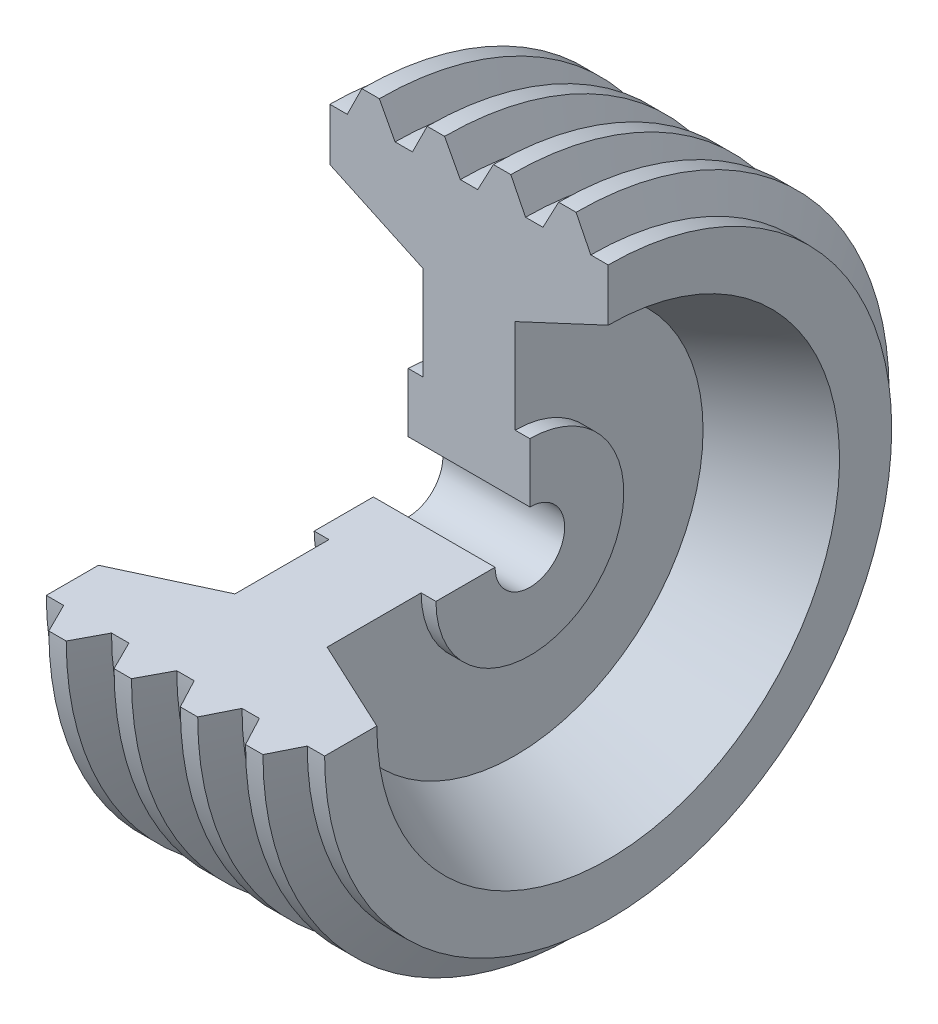
ISO-10303-21;
HEADER;
FILE_DESCRIPTION(('STEP AP214'),'2;1');
FILE_NAME('part.step','',(''),(''),'','','');
FILE_SCHEMA(('AUTOMOTIVE_DESIGN { 1 0 10303 214 1 1 1 1 }'));
ENDSEC;
DATA;
#1=APPLICATION_CONTEXT('core data for automotive mechanical design processes');
#2=APPLICATION_PROTOCOL_DEFINITION('international standard','automotive_design',2000,#1);
#3=PRODUCT_CONTEXT('',#1,'mechanical');
#4=PRODUCT('Part','Part','',(#3));
#5=PRODUCT_RELATED_PRODUCT_CATEGORY('part','',(#4));
#6=PRODUCT_DEFINITION_FORMATION('','',#4);
#7=PRODUCT_DEFINITION_CONTEXT('part definition',#1,'design');
#8=PRODUCT_DEFINITION('design','',#6,#7);
#9=PRODUCT_DEFINITION_SHAPE('','',#8);
#10=(LENGTH_UNIT() NAMED_UNIT(*) SI_UNIT(.MILLI.,.METRE.));
#11=(NAMED_UNIT(*) PLANE_ANGLE_UNIT() SI_UNIT($,.RADIAN.));
#12=(NAMED_UNIT(*) SI_UNIT($,.STERADIAN.) SOLID_ANGLE_UNIT());
#13=UNCERTAINTY_MEASURE_WITH_UNIT(LENGTH_MEASURE(1.E-05),#10,'distance_accuracy_value','');
#14=(GEOMETRIC_REPRESENTATION_CONTEXT(3) GLOBAL_UNCERTAINTY_ASSIGNED_CONTEXT((#13)) GLOBAL_UNIT_ASSIGNED_CONTEXT((#10,
#11,#12)) REPRESENTATION_CONTEXT('',''));
#15=CARTESIAN_POINT('',(0.,0.,0.));
#16=DIRECTION('',(0.,0.,1.));
#17=DIRECTION('',(1.,0.,0.));
#18=AXIS2_PLACEMENT_3D('',#15,#16,#17);
#19=CARTESIAN_POINT('',(35.,2.09488880330588E-13,20.));
#20=DIRECTION('',(1.,0.,0.));
#21=DIRECTION('',(0.,0.,-1.));
#22=AXIS2_PLACEMENT_3D('',#19,#20,#21);
#23=PLANE('',#22);
#24=CARTESIAN_POINT('',(35.,0.,0.));
#25=DIRECTION('',(1.,0.,0.));
#26=DIRECTION('',(0.,0.,-1.));
#27=AXIS2_PLACEMENT_3D('',#24,#25,#26);
#28=CIRCLE('',#27,54.);
#29=CARTESIAN_POINT('',(35.,5.65619976892588E-13,54.));
#30=VERTEX_POINT('',#29);
#31=CARTESIAN_POINT('',(35.,54.,0.));
#32=VERTEX_POINT('',#31);
#33=EDGE_CURVE('E11',#30,#32,#28,.T.);
#34=ORIENTED_EDGE('',*,*,#33,.T.);
#35=DIRECTION('',(0.,1.,0.));
#36=VECTOR('',#35,1.);
#37=CARTESIAN_POINT('',(35.,20.,0.));
#38=LINE('',#37,#36);
#39=CARTESIAN_POINT('',(35.,20.,0.));
#40=VERTEX_POINT('',#39);
#41=EDGE_CURVE('E221',#40,#32,#38,.T.);
#42=ORIENTED_EDGE('',*,*,#41,.F.);
#43=CARTESIAN_POINT('',(35.,0.,0.));
#44=DIRECTION('',(1.,0.,0.));
#45=DIRECTION('',(0.,0.,-1.));
#46=AXIS2_PLACEMENT_3D('',#43,#44,#45);
#47=CIRCLE('',#46,20.);
#48=CARTESIAN_POINT('',(35.,2.09488880330588E-13,20.));
#49=VERTEX_POINT('',#48);
#50=EDGE_CURVE('E52',#49,#40,#47,.T.);
#51=ORIENTED_EDGE('',*,*,#50,.F.);
#52=DIRECTION('',(0.,0.,1.));
#53=VECTOR('',#52,1.);
#54=CARTESIAN_POINT('',(35.,2.09488880330588E-13,20.));
#55=LINE('',#54,#53);
#56=EDGE_CURVE('E223',#49,#30,#55,.T.);
#57=ORIENTED_EDGE('',*,*,#56,.T.);
#58=EDGE_LOOP('',(#34,#42,#51,#57));
#59=FACE_BOUND('',#58,.T.);
#60=ADVANCED_FACE('F37',(#59),#23,.T.);
#61=CARTESIAN_POINT('',(0.,0.,0.));
#62=DIRECTION('',(1.,0.,0.));
#63=DIRECTION('',(0.,0.,-1.));
#64=AXIS2_PLACEMENT_3D('',#61,#62,#63);
#65=CYLINDRICAL_SURFACE('',#64,54.);
#66=CARTESIAN_POINT('',(26.5,0.,0.));
#67=DIRECTION('',(1.,0.,0.));
#68=DIRECTION('',(0.,0.,-1.));
#69=AXIS2_PLACEMENT_3D('',#66,#67,#68);
#70=CIRCLE('',#69,54.);
#71=CARTESIAN_POINT('',(26.5,5.65619976892588E-13,54.));
#72=VERTEX_POINT('',#71);
#73=CARTESIAN_POINT('',(26.5,54.,0.));
#74=VERTEX_POINT('',#73);
#75=EDGE_CURVE('E45',#72,#74,#70,.T.);
#76=ORIENTED_EDGE('',*,*,#75,.T.);
#77=DIRECTION('',(-1.,0.,0.));
#78=VECTOR('',#77,1.);
#79=CARTESIAN_POINT('',(35.,54.,0.));
#80=LINE('',#79,#78);
#81=EDGE_CURVE('E232',#32,#74,#80,.T.);
#82=ORIENTED_EDGE('',*,*,#81,.F.);
#83=ORIENTED_EDGE('',*,*,#33,.F.);
#84=DIRECTION('',(-1.,0.,0.));
#85=VECTOR('',#84,1.);
#86=CARTESIAN_POINT('',(35.,5.65619976892588E-13,54.));
#87=LINE('',#86,#85);
#88=EDGE_CURVE('E314',#30,#72,#87,.T.);
#89=ORIENTED_EDGE('',*,*,#88,.T.);
#90=EDGE_LOOP('',(#76,#82,#83,#89));
#91=FACE_BOUND('',#90,.T.);
#92=ADVANCED_FACE('F39',(#91),#65,.T.);
#93=CARTESIAN_POINT('',(26.5,5.65619976892588E-13,54.));
#94=DIRECTION('',(1.,0.,0.));
#95=DIRECTION('',(0.,0.,-1.));
#96=AXIS2_PLACEMENT_3D('',#93,#94,#95);
#97=PLANE('',#96);
#98=CARTESIAN_POINT('',(26.5,0.,0.));
#99=DIRECTION('',(1.,0.,0.));
#100=DIRECTION('',(0.,0.,-1.));
#101=AXIS2_PLACEMENT_3D('',#98,#99,#100);
#102=CIRCLE('',#101,108.052540288708);
#103=CARTESIAN_POINT('',(26.5,1.13179028409786E-12,108.052540288708));
#104=VERTEX_POINT('',#103);
#105=CARTESIAN_POINT('',(26.5,108.052540288708,0.));
#106=VERTEX_POINT('',#105);
#107=EDGE_CURVE('E440',#104,#106,#102,.T.);
#108=ORIENTED_EDGE('',*,*,#107,.T.);
#109=DIRECTION('',(0.,1.,0.));
#110=VECTOR('',#109,1.);
#111=CARTESIAN_POINT('',(26.5,54.,0.));
#112=LINE('',#111,#110);
#113=EDGE_CURVE('E237',#74,#106,#112,.T.);
#114=ORIENTED_EDGE('',*,*,#113,.F.);
#115=ORIENTED_EDGE('',*,*,#75,.F.);
#116=DIRECTION('',(0.,0.,1.));
#117=VECTOR('',#116,1.);
#118=CARTESIAN_POINT('',(26.5,5.65619976892588E-13,54.));
#119=LINE('',#118,#117);
#120=EDGE_CURVE('E316',#72,#104,#119,.T.);
#121=ORIENTED_EDGE('',*,*,#120,.T.);
#122=EDGE_LOOP('',(#108,#114,#115,#121));
#123=FACE_BOUND('',#122,.T.);
#124=ADVANCED_FACE('F442',(#123),#97,.T.);
#125=CARTESIAN_POINT('',(26.5,0.,0.));
#126=DIRECTION('',(1.,0.,0.));
#127=DIRECTION('',(0.,0.,-1.));
#128=AXIS2_PLACEMENT_3D('',#125,#126,#127);
#129=CONICAL_SURFACE('',#128,108.052540288708,0.43633231299858);
#130=CARTESIAN_POINT('',(80.,0.,0.));
#131=DIRECTION('',(1.,0.,0.));
#132=DIRECTION('',(0.,0.,-1.));
#133=AXIS2_PLACEMENT_3D('',#130,#131,#132);
#134=CIRCLE('',#133,133.);
#135=CARTESIAN_POINT('',(80.,1.39310105419841E-12,133.));
#136=VERTEX_POINT('',#135);
#137=CARTESIAN_POINT('',(80.,133.,0.));
#138=VERTEX_POINT('',#137);
#139=EDGE_CURVE('E438',#136,#138,#134,.T.);
#140=ORIENTED_EDGE('',*,*,#139,.T.);
#141=DIRECTION('',(0.906307787036651,0.422618261740697,0.));
#142=VECTOR('',#141,1.);
#143=CARTESIAN_POINT('',(26.5,108.052540288708,0.));
#144=LINE('',#143,#142);
#145=EDGE_CURVE('E239',#106,#138,#144,.T.);
#146=ORIENTED_EDGE('',*,*,#145,.F.);
#147=ORIENTED_EDGE('',*,*,#107,.F.);
#148=DIRECTION('',(0.906307787036651,0.,0.422618261740697));
#149=VECTOR('',#148,1.);
#150=CARTESIAN_POINT('',(26.5,1.13179028409786E-12,108.052540288708));
#151=LINE('',#150,#149);
#152=EDGE_CURVE('E319',#104,#136,#151,.T.);
#153=ORIENTED_EDGE('',*,*,#152,.T.);
#154=EDGE_LOOP('',(#140,#146,#147,#153));
#155=FACE_BOUND('',#154,.T.);
#156=ADVANCED_FACE('F448',(#155),#129,.F.);
#157=CARTESIAN_POINT('',(80.,1.39310105419841E-12,133.));
#158=DIRECTION('',(1.,0.,0.));
#159=DIRECTION('',(0.,0.,-1.));
#160=AXIS2_PLACEMENT_3D('',#157,#158,#159);
#161=PLANE('',#160);
#162=CARTESIAN_POINT('',(80.,0.,0.));
#163=DIRECTION('',(1.,0.,0.));
#164=DIRECTION('',(0.,0.,-1.));
#165=AXIS2_PLACEMENT_3D('',#162,#163,#164);
#166=CIRCLE('',#165,163.);
#167=CARTESIAN_POINT('',(80.,1.70733437469429E-12,163.));
#168=VERTEX_POINT('',#167);
#169=CARTESIAN_POINT('',(80.,163.,0.));
#170=VERTEX_POINT('',#169);
#171=EDGE_CURVE('E436',#168,#170,#166,.T.);
#172=ORIENTED_EDGE('',*,*,#171,.T.);
#173=DIRECTION('',(0.,1.,0.));
#174=VECTOR('',#173,1.);
#175=CARTESIAN_POINT('',(80.,133.,0.));
#176=LINE('',#175,#174);
#177=EDGE_CURVE('E244',#138,#170,#176,.T.);
#178=ORIENTED_EDGE('',*,*,#177,.F.);
#179=ORIENTED_EDGE('',*,*,#139,.F.);
#180=DIRECTION('',(0.,0.,1.));
#181=VECTOR('',#180,1.);
#182=CARTESIAN_POINT('',(80.,1.39310105419841E-12,133.));
#183=LINE('',#182,#181);
#184=EDGE_CURVE('E322',#136,#168,#183,.T.);
#185=ORIENTED_EDGE('',*,*,#184,.T.);
#186=EDGE_LOOP('',(#172,#178,#179,#185));
#187=FACE_BOUND('',#186,.T.);
#188=ADVANCED_FACE('F451',(#187),#161,.T.);
#189=CARTESIAN_POINT('',(0.,0.,0.));
#190=DIRECTION('',(1.,0.,0.));
#191=DIRECTION('',(0.,0.,-1.));
#192=AXIS2_PLACEMENT_3D('',#189,#190,#191);
#193=CYLINDRICAL_SURFACE('',#192,163.);
#194=CARTESIAN_POINT('',(70.,0.,0.));
#195=DIRECTION('',(1.,0.,0.));
#196=DIRECTION('',(0.,0.,-1.));
#197=AXIS2_PLACEMENT_3D('',#194,#195,#196);
#198=CIRCLE('',#197,163.);
#199=CARTESIAN_POINT('',(70.,1.70733437469429E-12,163.));
#200=VERTEX_POINT('',#199);
#201=CARTESIAN_POINT('',(70.,163.,0.));
#202=VERTEX_POINT('',#201);
#203=EDGE_CURVE('E434',#200,#202,#198,.T.);
#204=ORIENTED_EDGE('',*,*,#203,.T.);
#205=DIRECTION('',(-1.,0.,0.));
#206=VECTOR('',#205,1.);
#207=CARTESIAN_POINT('',(80.,163.,0.));
#208=LINE('',#207,#206);
#209=EDGE_CURVE('E247',#170,#202,#208,.T.);
#210=ORIENTED_EDGE('',*,*,#209,.F.);
#211=ORIENTED_EDGE('',*,*,#171,.F.);
#212=DIRECTION('',(-1.,0.,0.));
#213=VECTOR('',#212,1.);
#214=CARTESIAN_POINT('',(80.,1.70733437469429E-12,163.));
#215=LINE('',#214,#213);
#216=EDGE_CURVE('E325',#168,#200,#215,.T.);
#217=ORIENTED_EDGE('',*,*,#216,.T.);
#218=EDGE_LOOP('',(#204,#210,#211,#217));
#219=FACE_BOUND('',#218,.T.);
#220=ADVANCED_FACE('F456',(#219),#193,.T.);
#221=CARTESIAN_POINT('',(70.,0.,0.));
#222=DIRECTION('',(-1.,0.,0.));
#223=DIRECTION('',(0.,0.,1.));
#224=AXIS2_PLACEMENT_3D('',#221,#222,#223);
#225=CONICAL_SURFACE('',#224,163.,1.10898854020423);
#226=CARTESIAN_POINT('',(61.539060338245,0.,0.));
#227=DIRECTION('',(1.,0.,0.));
#228=DIRECTION('',(0.,0.,-1.));
#229=AXIS2_PLACEMENT_3D('',#226,#227,#228);
#230=CIRCLE('',#229,180.);
#231=CARTESIAN_POINT('',(61.539060338245,1.88539992297529E-12,180.));
#232=VERTEX_POINT('',#231);
#233=CARTESIAN_POINT('',(61.539060338245,180.,0.));
#234=VERTEX_POINT('',#233);
#235=EDGE_CURVE('E432',#232,#234,#230,.T.);
#236=ORIENTED_EDGE('',*,*,#235,.T.);
#237=DIRECTION('',(-0.445567252341254,0.895248470337183,0.));
#238=VECTOR('',#237,1.);
#239=CARTESIAN_POINT('',(70.,163.,0.));
#240=LINE('',#239,#238);
#241=EDGE_CURVE('E250',#202,#234,#240,.T.);
#242=ORIENTED_EDGE('',*,*,#241,.F.);
#243=ORIENTED_EDGE('',*,*,#203,.F.);
#244=DIRECTION('',(-0.445567252341254,0.,0.895248470337183));
#245=VECTOR('',#244,1.);
#246=CARTESIAN_POINT('',(70.,1.70733437469429E-12,163.));
#247=LINE('',#246,#245);
#248=EDGE_CURVE('E328',#200,#232,#247,.T.);
#249=ORIENTED_EDGE('',*,*,#248,.T.);
#250=EDGE_LOOP('',(#236,#242,#243,#249));
#251=FACE_BOUND('',#250,.T.);
#252=ADVANCED_FACE('F459',(#251),#225,.T.);
#253=CARTESIAN_POINT('',(0.,0.,0.));
#254=DIRECTION('',(1.,0.,0.));
#255=DIRECTION('',(0.,0.,-1.));
#256=AXIS2_PLACEMENT_3D('',#253,#254,#255);
#257=CYLINDRICAL_SURFACE('',#256,180.);
#258=CARTESIAN_POINT('',(51.539060338245,0.,0.));
#259=DIRECTION('',(1.,0.,0.));
#260=DIRECTION('',(0.,0.,-1.));
#261=AXIS2_PLACEMENT_3D('',#258,#259,#260);
#262=CIRCLE('',#261,180.);
#263=CARTESIAN_POINT('',(51.539060338245,1.88539992297529E-12,180.));
#264=VERTEX_POINT('',#263);
#265=CARTESIAN_POINT('',(51.539060338245,180.,0.));
#266=VERTEX_POINT('',#265);
#267=EDGE_CURVE('E430',#264,#266,#262,.T.);
#268=ORIENTED_EDGE('',*,*,#267,.T.);
#269=DIRECTION('',(-1.,0.,0.));
#270=VECTOR('',#269,1.);
#271=CARTESIAN_POINT('',(61.539060338245,180.,0.));
#272=LINE('',#271,#270);
#273=EDGE_CURVE('E253',#234,#266,#272,.T.);
#274=ORIENTED_EDGE('',*,*,#273,.F.);
#275=ORIENTED_EDGE('',*,*,#235,.F.);
#276=DIRECTION('',(-1.,0.,0.));
#277=VECTOR('',#276,1.);
#278=CARTESIAN_POINT('',(61.539060338245,1.88539992297529E-12,180.));
#279=LINE('',#278,#277);
#280=EDGE_CURVE('E331',#232,#264,#279,.T.);
#281=ORIENTED_EDGE('',*,*,#280,.T.);
#282=EDGE_LOOP('',(#268,#274,#275,#281));
#283=FACE_BOUND('',#282,.T.);
#284=ADVANCED_FACE('F464',(#283),#257,.T.);
#285=CARTESIAN_POINT('',(51.539060338245,0.,0.));
#286=DIRECTION('',(1.,0.,0.));
#287=DIRECTION('',(0.,0.,-1.));
#288=AXIS2_PLACEMENT_3D('',#285,#286,#287);
#289=CONICAL_SURFACE('',#288,180.,1.08210413623649);
#290=CARTESIAN_POINT('',(42.5,0.,0.));
#291=DIRECTION('',(1.,0.,0.));
#292=DIRECTION('',(0.,0.,-1.));
#293=AXIS2_PLACEMENT_3D('',#290,#291,#292);
#294=CIRCLE('',#293,163.);
#295=CARTESIAN_POINT('',(42.5,1.70733437469429E-12,163.));
#296=VERTEX_POINT('',#295);
#297=CARTESIAN_POINT('',(42.5,163.,0.));
#298=VERTEX_POINT('',#297);
#299=EDGE_CURVE('E428',#296,#298,#294,.T.);
#300=ORIENTED_EDGE('',*,*,#299,.T.);
#301=DIRECTION('',(-0.469471562785888,-0.882947592858928,0.));
#302=VECTOR('',#301,1.);
#303=CARTESIAN_POINT('',(51.539060338245,180.,0.));
#304=LINE('',#303,#302);
#305=EDGE_CURVE('E256',#266,#298,#304,.T.);
#306=ORIENTED_EDGE('',*,*,#305,.F.);
#307=ORIENTED_EDGE('',*,*,#267,.F.);
#308=DIRECTION('',(-0.469471562785888,0.,-0.882947592858928));
#309=VECTOR('',#308,1.);
#310=CARTESIAN_POINT('',(51.539060338245,1.88539992297529E-12,180.));
#311=LINE('',#310,#309);
#312=EDGE_CURVE('E334',#264,#296,#311,.T.);
#313=ORIENTED_EDGE('',*,*,#312,.T.);
#314=EDGE_LOOP('',(#300,#306,#307,#313));
#315=FACE_BOUND('',#314,.T.);
#316=ADVANCED_FACE('F467',(#315),#289,.T.);
#317=CARTESIAN_POINT('',(0.,0.,0.));
#318=DIRECTION('',(1.,0.,0.));
#319=DIRECTION('',(0.,0.,-1.));
#320=AXIS2_PLACEMENT_3D('',#317,#318,#319);
#321=CYLINDRICAL_SURFACE('',#320,163.);
#322=CARTESIAN_POINT('',(32.5,0.,0.));
#323=DIRECTION('',(1.,0.,0.));
#324=DIRECTION('',(0.,0.,-1.));
#325=AXIS2_PLACEMENT_3D('',#322,#323,#324);
#326=CIRCLE('',#325,163.);
#327=CARTESIAN_POINT('',(32.5,1.70733437469429E-12,163.));
#328=VERTEX_POINT('',#327);
#329=CARTESIAN_POINT('',(32.5,163.,0.));
#330=VERTEX_POINT('',#329);
#331=EDGE_CURVE('E426',#328,#330,#326,.T.);
#332=ORIENTED_EDGE('',*,*,#331,.T.);
#333=DIRECTION('',(-1.,0.,0.));
#334=VECTOR('',#333,1.);
#335=CARTESIAN_POINT('',(42.5,163.,0.));
#336=LINE('',#335,#334);
#337=EDGE_CURVE('E259',#298,#330,#336,.T.);
#338=ORIENTED_EDGE('',*,*,#337,.F.);
#339=ORIENTED_EDGE('',*,*,#299,.F.);
#340=DIRECTION('',(-1.,0.,0.));
#341=VECTOR('',#340,1.);
#342=CARTESIAN_POINT('',(42.5,1.70733437469429E-12,163.));
#343=LINE('',#342,#341);
#344=EDGE_CURVE('E337',#296,#328,#343,.T.);
#345=ORIENTED_EDGE('',*,*,#344,.T.);
#346=EDGE_LOOP('',(#332,#338,#339,#345));
#347=FACE_BOUND('',#346,.T.);
#348=ADVANCED_FACE('F472',(#347),#321,.T.);
#349=CARTESIAN_POINT('',(32.5,0.,0.));
#350=DIRECTION('',(-1.,0.,0.));
#351=DIRECTION('',(0.,0.,1.));
#352=AXIS2_PLACEMENT_3D('',#349,#350,#351);
#353=CONICAL_SURFACE('',#352,163.,1.10898854020423);
#354=CARTESIAN_POINT('',(24.039060338245,0.,0.));
#355=DIRECTION('',(1.,0.,0.));
#356=DIRECTION('',(0.,0.,-1.));
#357=AXIS2_PLACEMENT_3D('',#354,#355,#356);
#358=CIRCLE('',#357,180.);
#359=CARTESIAN_POINT('',(24.039060338245,1.88539992297529E-12,180.));
#360=VERTEX_POINT('',#359);
#361=CARTESIAN_POINT('',(24.039060338245,180.,0.));
#362=VERTEX_POINT('',#361);
#363=EDGE_CURVE('E424',#360,#362,#358,.T.);
#364=ORIENTED_EDGE('',*,*,#363,.T.);
#365=DIRECTION('',(-0.445567252341253,0.895248470337183,0.));
#366=VECTOR('',#365,1.);
#367=CARTESIAN_POINT('',(32.5,163.,0.));
#368=LINE('',#367,#366);
#369=EDGE_CURVE('E262',#330,#362,#368,.T.);
#370=ORIENTED_EDGE('',*,*,#369,.F.);
#371=ORIENTED_EDGE('',*,*,#331,.F.);
#372=DIRECTION('',(-0.445567252341253,0.,0.895248470337183));
#373=VECTOR('',#372,1.);
#374=CARTESIAN_POINT('',(32.5,1.70733437469429E-12,163.));
#375=LINE('',#374,#373);
#376=EDGE_CURVE('E340',#328,#360,#375,.T.);
#377=ORIENTED_EDGE('',*,*,#376,.T.);
#378=EDGE_LOOP('',(#364,#370,#371,#377));
#379=FACE_BOUND('',#378,.T.);
#380=ADVANCED_FACE('F475',(#379),#353,.T.);
#381=CARTESIAN_POINT('',(0.,0.,0.));
#382=DIRECTION('',(1.,0.,0.));
#383=DIRECTION('',(0.,0.,-1.));
#384=AXIS2_PLACEMENT_3D('',#381,#382,#383);
#385=CYLINDRICAL_SURFACE('',#384,180.);
#386=CARTESIAN_POINT('',(14.039060338245,0.,0.));
#387=DIRECTION('',(1.,0.,0.));
#388=DIRECTION('',(0.,0.,-1.));
#389=AXIS2_PLACEMENT_3D('',#386,#387,#388);
#390=CIRCLE('',#389,180.);
#391=CARTESIAN_POINT('',(14.039060338245,1.88539992297529E-12,180.));
#392=VERTEX_POINT('',#391);
#393=CARTESIAN_POINT('',(14.039060338245,180.,0.));
#394=VERTEX_POINT('',#393);
#395=EDGE_CURVE('E422',#392,#394,#390,.T.);
#396=ORIENTED_EDGE('',*,*,#395,.T.);
#397=DIRECTION('',(-1.,0.,0.));
#398=VECTOR('',#397,1.);
#399=CARTESIAN_POINT('',(24.039060338245,180.,0.));
#400=LINE('',#399,#398);
#401=EDGE_CURVE('E265',#362,#394,#400,.T.);
#402=ORIENTED_EDGE('',*,*,#401,.F.);
#403=ORIENTED_EDGE('',*,*,#363,.F.);
#404=DIRECTION('',(-1.,0.,0.));
#405=VECTOR('',#404,1.);
#406=CARTESIAN_POINT('',(24.039060338245,1.88539992297529E-12,180.));
#407=LINE('',#406,#405);
#408=EDGE_CURVE('E343',#360,#392,#407,.T.);
#409=ORIENTED_EDGE('',*,*,#408,.T.);
#410=EDGE_LOOP('',(#396,#402,#403,#409));
#411=FACE_BOUND('',#410,.T.);
#412=ADVANCED_FACE('F480',(#411),#385,.T.);
#413=CARTESIAN_POINT('',(14.039060338245,0.,0.));
#414=DIRECTION('',(1.,0.,0.));
#415=DIRECTION('',(0.,0.,-1.));
#416=AXIS2_PLACEMENT_3D('',#413,#414,#415);
#417=CONICAL_SURFACE('',#416,180.,1.08210413623649);
#418=CARTESIAN_POINT('',(4.99999999999996,0.,0.));
#419=DIRECTION('',(1.,0.,0.));
#420=DIRECTION('',(0.,0.,-1.));
#421=AXIS2_PLACEMENT_3D('',#418,#419,#420);
#422=CIRCLE('',#421,163.);
#423=CARTESIAN_POINT('',(4.99999999999996,1.70733437469429E-12,163.));
#424=VERTEX_POINT('',#423);
#425=CARTESIAN_POINT('',(4.99999999999996,163.,0.));
#426=VERTEX_POINT('',#425);
#427=EDGE_CURVE('E420',#424,#426,#422,.T.);
#428=ORIENTED_EDGE('',*,*,#427,.T.);
#429=DIRECTION('',(-0.469471562785889,-0.882947592858928,0.));
#430=VECTOR('',#429,1.);
#431=CARTESIAN_POINT('',(14.039060338245,180.,0.));
#432=LINE('',#431,#430);
#433=EDGE_CURVE('E268',#394,#426,#432,.T.);
#434=ORIENTED_EDGE('',*,*,#433,.F.);
#435=ORIENTED_EDGE('',*,*,#395,.F.);
#436=DIRECTION('',(-0.469471562785889,0.,-0.882947592858928));
#437=VECTOR('',#436,1.);
#438=CARTESIAN_POINT('',(14.039060338245,1.88539992297529E-12,180.));
#439=LINE('',#438,#437);
#440=EDGE_CURVE('E346',#392,#424,#439,.T.);
#441=ORIENTED_EDGE('',*,*,#440,.T.);
#442=EDGE_LOOP('',(#428,#434,#435,#441));
#443=FACE_BOUND('',#442,.T.);
#444=ADVANCED_FACE('F483',(#443),#417,.T.);
#445=CARTESIAN_POINT('',(0.,0.,0.));
#446=DIRECTION('',(1.,0.,0.));
#447=DIRECTION('',(0.,0.,-1.));
#448=AXIS2_PLACEMENT_3D('',#445,#446,#447);
#449=CYLINDRICAL_SURFACE('',#448,163.);
#450=CARTESIAN_POINT('',(-5.00000000000004,0.,0.));
#451=DIRECTION('',(1.,0.,0.));
#452=DIRECTION('',(0.,0.,-1.));
#453=AXIS2_PLACEMENT_3D('',#450,#451,#452);
#454=CIRCLE('',#453,163.);
#455=CARTESIAN_POINT('',(-5.00000000000004,1.70733437469429E-12,163.));
#456=VERTEX_POINT('',#455);
#457=CARTESIAN_POINT('',(-5.00000000000004,163.,0.));
#458=VERTEX_POINT('',#457);
#459=EDGE_CURVE('E418',#456,#458,#454,.T.);
#460=ORIENTED_EDGE('',*,*,#459,.T.);
#461=DIRECTION('',(-1.,0.,0.));
#462=VECTOR('',#461,1.);
#463=CARTESIAN_POINT('',(4.99999999999996,163.,0.));
#464=LINE('',#463,#462);
#465=EDGE_CURVE('E271',#426,#458,#464,.T.);
#466=ORIENTED_EDGE('',*,*,#465,.F.);
#467=ORIENTED_EDGE('',*,*,#427,.F.);
#468=DIRECTION('',(-1.,0.,0.));
#469=VECTOR('',#468,1.);
#470=CARTESIAN_POINT('',(4.99999999999996,1.70733437469429E-12,163.));
#471=LINE('',#470,#469);
#472=EDGE_CURVE('E349',#424,#456,#471,.T.);
#473=ORIENTED_EDGE('',*,*,#472,.T.);
#474=EDGE_LOOP('',(#460,#466,#467,#473));
#475=FACE_BOUND('',#474,.T.);
#476=ADVANCED_FACE('F488',(#475),#449,.T.);
#477=CARTESIAN_POINT('',(-5.00000000000004,0.,0.));
#478=DIRECTION('',(-1.,0.,0.));
#479=DIRECTION('',(0.,0.,1.));
#480=AXIS2_PLACEMENT_3D('',#477,#478,#479);
#481=CONICAL_SURFACE('',#480,163.,1.08210413623649);
#482=CARTESIAN_POINT('',(-14.0390603382451,0.,0.));
#483=DIRECTION('',(1.,0.,0.));
#484=DIRECTION('',(0.,0.,-1.));
#485=AXIS2_PLACEMENT_3D('',#482,#483,#484);
#486=CIRCLE('',#485,180.);
#487=CARTESIAN_POINT('',(-14.0390603382451,1.88539992297529E-12,180.));
#488=VERTEX_POINT('',#487);
#489=CARTESIAN_POINT('',(-14.0390603382451,180.,0.));
#490=VERTEX_POINT('',#489);
#491=EDGE_CURVE('E416',#488,#490,#486,.T.);
#492=ORIENTED_EDGE('',*,*,#491,.T.);
#493=DIRECTION('',(-0.469471562785889,0.882947592858928,0.));
#494=VECTOR('',#493,1.);
#495=CARTESIAN_POINT('',(-14.0390603382451,180.,0.));
#496=LINE('',#495,#494);
#497=EDGE_CURVE('E274',#458,#490,#496,.T.);
#498=ORIENTED_EDGE('',*,*,#497,.F.);
#499=ORIENTED_EDGE('',*,*,#459,.F.);
#500=DIRECTION('',(-0.469471562785889,0.,0.882947592858928));
#501=VECTOR('',#500,1.);
#502=CARTESIAN_POINT('',(-14.0390603382451,1.88539992297529E-12,180.));
#503=LINE('',#502,#501);
#504=EDGE_CURVE('E352',#456,#488,#503,.T.);
#505=ORIENTED_EDGE('',*,*,#504,.T.);
#506=EDGE_LOOP('',(#492,#498,#499,#505));
#507=FACE_BOUND('',#506,.T.);
#508=ADVANCED_FACE('F491',(#507),#481,.T.);
#509=CARTESIAN_POINT('',(0.,0.,0.));
#510=DIRECTION('',(1.,0.,0.));
#511=DIRECTION('',(0.,0.,-1.));
#512=AXIS2_PLACEMENT_3D('',#509,#510,#511);
#513=CYLINDRICAL_SURFACE('',#512,180.);
#514=CARTESIAN_POINT('',(-24.0390603382451,0.,0.));
#515=DIRECTION('',(1.,0.,0.));
#516=DIRECTION('',(0.,0.,-1.));
#517=AXIS2_PLACEMENT_3D('',#514,#515,#516);
#518=CIRCLE('',#517,180.);
#519=CARTESIAN_POINT('',(-24.0390603382451,1.88539992297529E-12,180.));
#520=VERTEX_POINT('',#519);
#521=CARTESIAN_POINT('',(-24.0390603382451,180.,0.));
#522=VERTEX_POINT('',#521);
#523=EDGE_CURVE('E414',#520,#522,#518,.T.);
#524=ORIENTED_EDGE('',*,*,#523,.T.);
#525=DIRECTION('',(-1.,0.,0.));
#526=VECTOR('',#525,1.);
#527=CARTESIAN_POINT('',(-24.0390603382451,180.,0.));
#528=LINE('',#527,#526);
#529=EDGE_CURVE('E277',#490,#522,#528,.T.);
#530=ORIENTED_EDGE('',*,*,#529,.F.);
#531=ORIENTED_EDGE('',*,*,#491,.F.);
#532=DIRECTION('',(-1.,0.,0.));
#533=VECTOR('',#532,1.);
#534=CARTESIAN_POINT('',(-24.0390603382451,1.88539992297529E-12,180.));
#535=LINE('',#534,#533);
#536=EDGE_CURVE('E355',#488,#520,#535,.T.);
#537=ORIENTED_EDGE('',*,*,#536,.T.);
#538=EDGE_LOOP('',(#524,#530,#531,#537));
#539=FACE_BOUND('',#538,.T.);
#540=ADVANCED_FACE('F496',(#539),#513,.T.);
#541=CARTESIAN_POINT('',(-24.0390603382451,0.,0.));
#542=DIRECTION('',(1.,0.,0.));
#543=DIRECTION('',(0.,0.,-1.));
#544=AXIS2_PLACEMENT_3D('',#541,#542,#543);
#545=CONICAL_SURFACE('',#544,180.,1.10898854020423);
#546=CARTESIAN_POINT('',(-32.5,0.,0.));
#547=DIRECTION('',(1.,0.,0.));
#548=DIRECTION('',(0.,0.,-1.));
#549=AXIS2_PLACEMENT_3D('',#546,#547,#548);
#550=CIRCLE('',#549,163.);
#551=CARTESIAN_POINT('',(-32.5,1.70733437469429E-12,163.));
#552=VERTEX_POINT('',#551);
#553=CARTESIAN_POINT('',(-32.5,163.,0.));
#554=VERTEX_POINT('',#553);
#555=EDGE_CURVE('E412',#552,#554,#550,.T.);
#556=ORIENTED_EDGE('',*,*,#555,.T.);
#557=DIRECTION('',(-0.445567252341252,-0.895248470337183,0.));
#558=VECTOR('',#557,1.);
#559=CARTESIAN_POINT('',(-32.5,163.,0.));
#560=LINE('',#559,#558);
#561=EDGE_CURVE('E280',#522,#554,#560,.T.);
#562=ORIENTED_EDGE('',*,*,#561,.F.);
#563=ORIENTED_EDGE('',*,*,#523,.F.);
#564=DIRECTION('',(-0.445567252341252,0.,-0.895248470337183));
#565=VECTOR('',#564,1.);
#566=CARTESIAN_POINT('',(-32.5,1.70733437469429E-12,163.));
#567=LINE('',#566,#565);
#568=EDGE_CURVE('E358',#520,#552,#567,.T.);
#569=ORIENTED_EDGE('',*,*,#568,.T.);
#570=EDGE_LOOP('',(#556,#562,#563,#569));
#571=FACE_BOUND('',#570,.T.);
#572=ADVANCED_FACE('F499',(#571),#545,.T.);
#573=CARTESIAN_POINT('',(0.,0.,0.));
#574=DIRECTION('',(1.,0.,0.));
#575=DIRECTION('',(0.,0.,-1.));
#576=AXIS2_PLACEMENT_3D('',#573,#574,#575);
#577=CYLINDRICAL_SURFACE('',#576,163.);
#578=CARTESIAN_POINT('',(-42.5,0.,0.));
#579=DIRECTION('',(1.,0.,0.));
#580=DIRECTION('',(0.,0.,-1.));
#581=AXIS2_PLACEMENT_3D('',#578,#579,#580);
#582=CIRCLE('',#581,163.);
#583=CARTESIAN_POINT('',(-42.5,1.70733437469429E-12,163.));
#584=VERTEX_POINT('',#583);
#585=CARTESIAN_POINT('',(-42.5,163.,0.));
#586=VERTEX_POINT('',#585);
#587=EDGE_CURVE('E410',#584,#586,#582,.T.);
#588=ORIENTED_EDGE('',*,*,#587,.T.);
#589=DIRECTION('',(-1.,0.,0.));
#590=VECTOR('',#589,1.);
#591=CARTESIAN_POINT('',(-42.5,163.,0.));
#592=LINE('',#591,#590);
#593=EDGE_CURVE('E283',#554,#586,#592,.T.);
#594=ORIENTED_EDGE('',*,*,#593,.F.);
#595=ORIENTED_EDGE('',*,*,#555,.F.);
#596=DIRECTION('',(-1.,0.,0.));
#597=VECTOR('',#596,1.);
#598=CARTESIAN_POINT('',(-42.5,1.70733437469429E-12,163.));
#599=LINE('',#598,#597);
#600=EDGE_CURVE('E361',#552,#584,#599,.T.);
#601=ORIENTED_EDGE('',*,*,#600,.T.);
#602=EDGE_LOOP('',(#588,#594,#595,#601));
#603=FACE_BOUND('',#602,.T.);
#604=ADVANCED_FACE('F504',(#603),#577,.T.);
#605=CARTESIAN_POINT('',(-42.5,0.,0.));
#606=DIRECTION('',(-1.,0.,0.));
#607=DIRECTION('',(0.,0.,1.));
#608=AXIS2_PLACEMENT_3D('',#605,#606,#607);
#609=CONICAL_SURFACE('',#608,163.,1.08210413623649);
#610=CARTESIAN_POINT('',(-51.5390603382451,0.,0.));
#611=DIRECTION('',(1.,0.,0.));
#612=DIRECTION('',(0.,0.,-1.));
#613=AXIS2_PLACEMENT_3D('',#610,#611,#612);
#614=CIRCLE('',#613,180.);
#615=CARTESIAN_POINT('',(-51.5390603382451,1.88539992297529E-12,180.));
#616=VERTEX_POINT('',#615);
#617=CARTESIAN_POINT('',(-51.5390603382451,180.,0.));
#618=VERTEX_POINT('',#617);
#619=EDGE_CURVE('E408',#616,#618,#614,.T.);
#620=ORIENTED_EDGE('',*,*,#619,.T.);
#621=DIRECTION('',(-0.469471562785888,0.882947592858928,0.));
#622=VECTOR('',#621,1.);
#623=CARTESIAN_POINT('',(-51.5390603382451,180.,0.));
#624=LINE('',#623,#622);
#625=EDGE_CURVE('E286',#586,#618,#624,.T.);
#626=ORIENTED_EDGE('',*,*,#625,.F.);
#627=ORIENTED_EDGE('',*,*,#587,.F.);
#628=DIRECTION('',(-0.469471562785888,0.,0.882947592858928));
#629=VECTOR('',#628,1.);
#630=CARTESIAN_POINT('',(-51.5390603382451,1.88539992297529E-12,180.));
#631=LINE('',#630,#629);
#632=EDGE_CURVE('E364',#584,#616,#631,.T.);
#633=ORIENTED_EDGE('',*,*,#632,.T.);
#634=EDGE_LOOP('',(#620,#626,#627,#633));
#635=FACE_BOUND('',#634,.T.);
#636=ADVANCED_FACE('F507',(#635),#609,.T.);
#637=CARTESIAN_POINT('',(0.,0.,0.));
#638=DIRECTION('',(1.,0.,0.));
#639=DIRECTION('',(0.,0.,-1.));
#640=AXIS2_PLACEMENT_3D('',#637,#638,#639);
#641=CYLINDRICAL_SURFACE('',#640,180.);
#642=CARTESIAN_POINT('',(-61.5390603382451,0.,0.));
#643=DIRECTION('',(1.,0.,0.));
#644=DIRECTION('',(0.,0.,-1.));
#645=AXIS2_PLACEMENT_3D('',#642,#643,#644);
#646=CIRCLE('',#645,180.);
#647=CARTESIAN_POINT('',(-61.5390603382451,1.88539992297529E-12,180.));
#648=VERTEX_POINT('',#647);
#649=CARTESIAN_POINT('',(-61.5390603382451,180.,0.));
#650=VERTEX_POINT('',#649);
#651=EDGE_CURVE('E406',#648,#650,#646,.T.);
#652=ORIENTED_EDGE('',*,*,#651,.T.);
#653=DIRECTION('',(-1.,0.,0.));
#654=VECTOR('',#653,1.);
#655=CARTESIAN_POINT('',(-61.5390603382451,180.,0.));
#656=LINE('',#655,#654);
#657=EDGE_CURVE('E289',#618,#650,#656,.T.);
#658=ORIENTED_EDGE('',*,*,#657,.F.);
#659=ORIENTED_EDGE('',*,*,#619,.F.);
#660=DIRECTION('',(-1.,0.,0.));
#661=VECTOR('',#660,1.);
#662=CARTESIAN_POINT('',(-61.5390603382451,1.88539992297529E-12,180.));
#663=LINE('',#662,#661);
#664=EDGE_CURVE('E367',#616,#648,#663,.T.);
#665=ORIENTED_EDGE('',*,*,#664,.T.);
#666=EDGE_LOOP('',(#652,#658,#659,#665));
#667=FACE_BOUND('',#666,.T.);
#668=ADVANCED_FACE('F512',(#667),#641,.T.);
#669=CARTESIAN_POINT('',(-61.5390603382451,0.,0.));
#670=DIRECTION('',(1.,0.,0.));
#671=DIRECTION('',(0.,0.,-1.));
#672=AXIS2_PLACEMENT_3D('',#669,#670,#671);
#673=CONICAL_SURFACE('',#672,180.,1.10898854020423);
#674=CARTESIAN_POINT('',(-70.,0.,0.));
#675=DIRECTION('',(1.,0.,0.));
#676=DIRECTION('',(0.,0.,-1.));
#677=AXIS2_PLACEMENT_3D('',#674,#675,#676);
#678=CIRCLE('',#677,163.);
#679=CARTESIAN_POINT('',(-70.,1.70733437469429E-12,163.));
#680=VERTEX_POINT('',#679);
#681=CARTESIAN_POINT('',(-70.,163.,0.));
#682=VERTEX_POINT('',#681);
#683=EDGE_CURVE('E404',#680,#682,#678,.T.);
#684=ORIENTED_EDGE('',*,*,#683,.T.);
#685=DIRECTION('',(-0.445567252341252,-0.895248470337183,0.));
#686=VECTOR('',#685,1.);
#687=CARTESIAN_POINT('',(-70.,163.,0.));
#688=LINE('',#687,#686);
#689=EDGE_CURVE('E292',#650,#682,#688,.T.);
#690=ORIENTED_EDGE('',*,*,#689,.F.);
#691=ORIENTED_EDGE('',*,*,#651,.F.);
#692=DIRECTION('',(-0.445567252341252,0.,-0.895248470337183));
#693=VECTOR('',#692,1.);
#694=CARTESIAN_POINT('',(-70.,1.70733437469429E-12,163.));
#695=LINE('',#694,#693);
#696=EDGE_CURVE('E370',#648,#680,#695,.T.);
#697=ORIENTED_EDGE('',*,*,#696,.T.);
#698=EDGE_LOOP('',(#684,#690,#691,#697));
#699=FACE_BOUND('',#698,.T.);
#700=ADVANCED_FACE('F515',(#699),#673,.T.);
#701=CARTESIAN_POINT('',(0.,0.,0.));
#702=DIRECTION('',(1.,0.,0.));
#703=DIRECTION('',(0.,0.,-1.));
#704=AXIS2_PLACEMENT_3D('',#701,#702,#703);
#705=CYLINDRICAL_SURFACE('',#704,163.);
#706=CARTESIAN_POINT('',(-80.,0.,0.));
#707=DIRECTION('',(1.,0.,0.));
#708=DIRECTION('',(0.,0.,-1.));
#709=AXIS2_PLACEMENT_3D('',#706,#707,#708);
#710=CIRCLE('',#709,163.);
#711=CARTESIAN_POINT('',(-80.,1.70733437469429E-12,163.));
#712=VERTEX_POINT('',#711);
#713=CARTESIAN_POINT('',(-80.,163.,0.));
#714=VERTEX_POINT('',#713);
#715=EDGE_CURVE('E402',#712,#714,#710,.T.);
#716=ORIENTED_EDGE('',*,*,#715,.T.);
#717=DIRECTION('',(-1.,0.,0.));
#718=VECTOR('',#717,1.);
#719=CARTESIAN_POINT('',(-80.,163.,0.));
#720=LINE('',#719,#718);
#721=EDGE_CURVE('E295',#682,#714,#720,.T.);
#722=ORIENTED_EDGE('',*,*,#721,.F.);
#723=ORIENTED_EDGE('',*,*,#683,.F.);
#724=DIRECTION('',(-1.,0.,0.));
#725=VECTOR('',#724,1.);
#726=CARTESIAN_POINT('',(-80.,1.70733437469429E-12,163.));
#727=LINE('',#726,#725);
#728=EDGE_CURVE('E373',#680,#712,#727,.T.);
#729=ORIENTED_EDGE('',*,*,#728,.T.);
#730=EDGE_LOOP('',(#716,#722,#723,#729));
#731=FACE_BOUND('',#730,.T.);
#732=ADVANCED_FACE('F520',(#731),#705,.T.);
#733=CARTESIAN_POINT('',(-80.,1.39310105419841E-12,133.));
#734=DIRECTION('',(-1.,0.,0.));
#735=DIRECTION('',(0.,0.,1.));
#736=AXIS2_PLACEMENT_3D('',#733,#734,#735);
#737=PLANE('',#736);
#738=CARTESIAN_POINT('',(-80.,0.,0.));
#739=DIRECTION('',(1.,0.,0.));
#740=DIRECTION('',(0.,0.,-1.));
#741=AXIS2_PLACEMENT_3D('',#738,#739,#740);
#742=CIRCLE('',#741,133.);
#743=CARTESIAN_POINT('',(-80.,1.39310105419841E-12,133.));
#744=VERTEX_POINT('',#743);
#745=CARTESIAN_POINT('',(-80.,133.,0.));
#746=VERTEX_POINT('',#745);
#747=EDGE_CURVE('E400',#744,#746,#742,.T.);
#748=ORIENTED_EDGE('',*,*,#747,.T.);
#749=DIRECTION('',(0.,-1.,0.));
#750=VECTOR('',#749,1.);
#751=CARTESIAN_POINT('',(-80.,133.,0.));
#752=LINE('',#751,#750);
#753=EDGE_CURVE('E298',#714,#746,#752,.T.);
#754=ORIENTED_EDGE('',*,*,#753,.F.);
#755=ORIENTED_EDGE('',*,*,#715,.F.);
#756=DIRECTION('',(0.,0.,-1.));
#757=VECTOR('',#756,1.);
#758=CARTESIAN_POINT('',(-80.,1.39310105419841E-12,133.));
#759=LINE('',#758,#757);
#760=EDGE_CURVE('E376',#712,#744,#759,.T.);
#761=ORIENTED_EDGE('',*,*,#760,.T.);
#762=EDGE_LOOP('',(#748,#754,#755,#761));
#763=FACE_BOUND('',#762,.T.);
#764=ADVANCED_FACE('F523',(#763),#737,.T.);
#765=CARTESIAN_POINT('',(-80.,0.,0.));
#766=DIRECTION('',(-1.,0.,0.));
#767=DIRECTION('',(0.,0.,1.));
#768=AXIS2_PLACEMENT_3D('',#765,#766,#767);
#769=CONICAL_SURFACE('',#768,133.,0.43633231299858);
#770=CARTESIAN_POINT('',(-26.5,0.,0.));
#771=DIRECTION('',(1.,0.,0.));
#772=DIRECTION('',(0.,0.,-1.));
#773=AXIS2_PLACEMENT_3D('',#770,#771,#772);
#774=CIRCLE('',#773,108.052540288708);
#775=CARTESIAN_POINT('',(-26.5,1.13179028409786E-12,108.052540288708));
#776=VERTEX_POINT('',#775);
#777=CARTESIAN_POINT('',(-26.5,108.052540288708,0.));
#778=VERTEX_POINT('',#777);
#779=EDGE_CURVE('E398',#776,#778,#774,.T.);
#780=ORIENTED_EDGE('',*,*,#779,.T.);
#781=DIRECTION('',(0.906307787036651,-0.422618261740697,0.));
#782=VECTOR('',#781,1.);
#783=CARTESIAN_POINT('',(-26.5,108.052540288708,0.));
#784=LINE('',#783,#782);
#785=EDGE_CURVE('E301',#746,#778,#784,.T.);
#786=ORIENTED_EDGE('',*,*,#785,.F.);
#787=ORIENTED_EDGE('',*,*,#747,.F.);
#788=DIRECTION('',(0.906307787036651,0.,-0.422618261740697));
#789=VECTOR('',#788,1.);
#790=CARTESIAN_POINT('',(-26.5,1.13179028409786E-12,108.052540288708));
#791=LINE('',#790,#789);
#792=EDGE_CURVE('E379',#744,#776,#791,.T.);
#793=ORIENTED_EDGE('',*,*,#792,.T.);
#794=EDGE_LOOP('',(#780,#786,#787,#793));
#795=FACE_BOUND('',#794,.T.);
#796=ADVANCED_FACE('F528',(#795),#769,.F.);
#797=CARTESIAN_POINT('',(-26.5,5.65619976892588E-13,54.));
#798=DIRECTION('',(-1.,0.,0.));
#799=DIRECTION('',(0.,0.,1.));
#800=AXIS2_PLACEMENT_3D('',#797,#798,#799);
#801=PLANE('',#800);
#802=CARTESIAN_POINT('',(-26.5,0.,0.));
#803=DIRECTION('',(1.,0.,0.));
#804=DIRECTION('',(0.,0.,-1.));
#805=AXIS2_PLACEMENT_3D('',#802,#803,#804);
#806=CIRCLE('',#805,54.);
#807=CARTESIAN_POINT('',(-26.5,5.65619976892588E-13,54.));
#808=VERTEX_POINT('',#807);
#809=CARTESIAN_POINT('',(-26.5,54.,0.));
#810=VERTEX_POINT('',#809);
#811=EDGE_CURVE('E396',#808,#810,#806,.T.);
#812=ORIENTED_EDGE('',*,*,#811,.T.);
#813=DIRECTION('',(0.,-1.,0.));
#814=VECTOR('',#813,1.);
#815=CARTESIAN_POINT('',(-26.5,54.,0.));
#816=LINE('',#815,#814);
#817=EDGE_CURVE('E304',#778,#810,#816,.T.);
#818=ORIENTED_EDGE('',*,*,#817,.F.);
#819=ORIENTED_EDGE('',*,*,#779,.F.);
#820=DIRECTION('',(0.,0.,-1.));
#821=VECTOR('',#820,1.);
#822=CARTESIAN_POINT('',(-26.5,5.65619976892588E-13,54.));
#823=LINE('',#822,#821);
#824=EDGE_CURVE('E382',#776,#808,#823,.T.);
#825=ORIENTED_EDGE('',*,*,#824,.T.);
#826=EDGE_LOOP('',(#812,#818,#819,#825));
#827=FACE_BOUND('',#826,.T.);
#828=ADVANCED_FACE('F531',(#827),#801,.T.);
#829=CARTESIAN_POINT('',(0.,0.,0.));
#830=DIRECTION('',(1.,0.,0.));
#831=DIRECTION('',(0.,0.,-1.));
#832=AXIS2_PLACEMENT_3D('',#829,#830,#831);
#833=CYLINDRICAL_SURFACE('',#832,54.);
#834=CARTESIAN_POINT('',(-35.,0.,0.));
#835=DIRECTION('',(1.,0.,0.));
#836=DIRECTION('',(0.,0.,-1.));
#837=AXIS2_PLACEMENT_3D('',#834,#835,#836);
#838=CIRCLE('',#837,54.);
#839=CARTESIAN_POINT('',(-35.,5.65619976892588E-13,54.));
#840=VERTEX_POINT('',#839);
#841=CARTESIAN_POINT('',(-35.,54.,0.));
#842=VERTEX_POINT('',#841);
#843=EDGE_CURVE('E394',#840,#842,#838,.T.);
#844=ORIENTED_EDGE('',*,*,#843,.T.);
#845=DIRECTION('',(-1.,0.,0.));
#846=VECTOR('',#845,1.);
#847=CARTESIAN_POINT('',(-35.,54.,0.));
#848=LINE('',#847,#846);
#849=EDGE_CURVE('E307',#810,#842,#848,.T.);
#850=ORIENTED_EDGE('',*,*,#849,.F.);
#851=ORIENTED_EDGE('',*,*,#811,.F.);
#852=DIRECTION('',(-1.,0.,0.));
#853=VECTOR('',#852,1.);
#854=CARTESIAN_POINT('',(-35.,5.65619976892588E-13,54.));
#855=LINE('',#854,#853);
#856=EDGE_CURVE('E385',#808,#840,#855,.T.);
#857=ORIENTED_EDGE('',*,*,#856,.T.);
#858=EDGE_LOOP('',(#844,#850,#851,#857));
#859=FACE_BOUND('',#858,.T.);
#860=ADVANCED_FACE('F536',(#859),#833,.T.);
#861=CARTESIAN_POINT('',(-35.,2.09488880330588E-13,20.));
#862=DIRECTION('',(-1.,0.,0.));
#863=DIRECTION('',(0.,0.,1.));
#864=AXIS2_PLACEMENT_3D('',#861,#862,#863);
#865=PLANE('',#864);
#866=CARTESIAN_POINT('',(-35.,0.,0.));
#867=DIRECTION('',(1.,0.,0.));
#868=DIRECTION('',(0.,0.,-1.));
#869=AXIS2_PLACEMENT_3D('',#866,#867,#868);
#870=CIRCLE('',#869,20.);
#871=CARTESIAN_POINT('',(-35.,2.09488880330588E-13,20.));
#872=VERTEX_POINT('',#871);
#873=CARTESIAN_POINT('',(-35.,20.,0.));
#874=VERTEX_POINT('',#873);
#875=EDGE_CURVE('E60',#872,#874,#870,.T.);
#876=ORIENTED_EDGE('',*,*,#875,.T.);
#877=DIRECTION('',(0.,-1.,0.));
#878=VECTOR('',#877,1.);
#879=CARTESIAN_POINT('',(-35.,20.,0.));
#880=LINE('',#879,#878);
#881=EDGE_CURVE('E310',#842,#874,#880,.T.);
#882=ORIENTED_EDGE('',*,*,#881,.F.);
#883=ORIENTED_EDGE('',*,*,#843,.F.);
#884=DIRECTION('',(0.,0.,-1.));
#885=VECTOR('',#884,1.);
#886=CARTESIAN_POINT('',(-35.,2.09488880330588E-13,20.));
#887=LINE('',#886,#885);
#888=EDGE_CURVE('E388',#840,#872,#887,.T.);
#889=ORIENTED_EDGE('',*,*,#888,.T.);
#890=EDGE_LOOP('',(#876,#882,#883,#889));
#891=FACE_BOUND('',#890,.T.);
#892=ADVANCED_FACE('F539',(#891),#865,.T.);
#893=CARTESIAN_POINT('',(0.,0.,0.));
#894=DIRECTION('',(1.,0.,0.));
#895=DIRECTION('',(0.,0.,-1.));
#896=AXIS2_PLACEMENT_3D('',#893,#894,#895);
#897=CYLINDRICAL_SURFACE('',#896,20.);
#898=DIRECTION('',(1.,0.,0.));
#899=VECTOR('',#898,1.);
#900=CARTESIAN_POINT('',(-35.,2.09488880330588E-13,20.));
#901=LINE('',#900,#899);
#902=EDGE_CURVE('E390',#872,#49,#901,.T.);
#903=ORIENTED_EDGE('',*,*,#902,.T.);
#904=ORIENTED_EDGE('',*,*,#50,.T.);
#905=DIRECTION('',(1.,0.,0.));
#906=VECTOR('',#905,1.);
#907=CARTESIAN_POINT('',(-35.,20.,0.));
#908=LINE('',#907,#906);
#909=EDGE_CURVE('E235',#874,#40,#908,.T.);
#910=ORIENTED_EDGE('',*,*,#909,.F.);
#911=ORIENTED_EDGE('',*,*,#875,.F.);
#912=EDGE_LOOP('',(#903,#904,#910,#911));
#913=FACE_BOUND('',#912,.T.);
#914=ADVANCED_FACE('F541',(#913),#897,.F.);
#915=CARTESIAN_POINT('',(0.,0.,0.));
#916=DIRECTION('',(0.,-1.,0.));
#917=DIRECTION('',(1.,0.,0.));
#918=AXIS2_PLACEMENT_3D('',#915,#916,#917);
#919=PLANE('',#918);
#920=ORIENTED_EDGE('',*,*,#56,.F.);
#921=ORIENTED_EDGE('',*,*,#902,.F.);
#922=ORIENTED_EDGE('',*,*,#888,.F.);
#923=ORIENTED_EDGE('',*,*,#856,.F.);
#924=ORIENTED_EDGE('',*,*,#824,.F.);
#925=ORIENTED_EDGE('',*,*,#792,.F.);
#926=ORIENTED_EDGE('',*,*,#760,.F.);
#927=ORIENTED_EDGE('',*,*,#728,.F.);
#928=ORIENTED_EDGE('',*,*,#696,.F.);
#929=ORIENTED_EDGE('',*,*,#664,.F.);
#930=ORIENTED_EDGE('',*,*,#632,.F.);
#931=ORIENTED_EDGE('',*,*,#600,.F.);
#932=ORIENTED_EDGE('',*,*,#568,.F.);
#933=ORIENTED_EDGE('',*,*,#536,.F.);
#934=ORIENTED_EDGE('',*,*,#504,.F.);
#935=ORIENTED_EDGE('',*,*,#472,.F.);
#936=ORIENTED_EDGE('',*,*,#440,.F.);
#937=ORIENTED_EDGE('',*,*,#408,.F.);
#938=ORIENTED_EDGE('',*,*,#376,.F.);
#939=ORIENTED_EDGE('',*,*,#344,.F.);
#940=ORIENTED_EDGE('',*,*,#312,.F.);
#941=ORIENTED_EDGE('',*,*,#280,.F.);
#942=ORIENTED_EDGE('',*,*,#248,.F.);
#943=ORIENTED_EDGE('',*,*,#216,.F.);
#944=ORIENTED_EDGE('',*,*,#184,.F.);
#945=ORIENTED_EDGE('',*,*,#152,.F.);
#946=ORIENTED_EDGE('',*,*,#120,.F.);
#947=ORIENTED_EDGE('',*,*,#88,.F.);
#948=EDGE_LOOP('',(#920,#921,#922,#923,#924,#925,#926,#927,#928,#929,#930,#931,#932,#933,#934,
#935,#936,#937,#938,#939,#940,#941,#942,#943,#944,#945,#946,#947));
#949=FACE_BOUND('',#948,.T.);
#950=ADVANCED_FACE('F543',(#949),#919,.F.);
#951=CARTESIAN_POINT('',(0.,0.,0.));
#952=DIRECTION('',(0.,0.,1.));
#953=DIRECTION('',(1.,0.,0.));
#954=AXIS2_PLACEMENT_3D('',#951,#952,#953);
#955=PLANE('',#954);
#956=ORIENTED_EDGE('',*,*,#41,.T.);
#957=ORIENTED_EDGE('',*,*,#81,.T.);
#958=ORIENTED_EDGE('',*,*,#113,.T.);
#959=ORIENTED_EDGE('',*,*,#145,.T.);
#960=ORIENTED_EDGE('',*,*,#177,.T.);
#961=ORIENTED_EDGE('',*,*,#209,.T.);
#962=ORIENTED_EDGE('',*,*,#241,.T.);
#963=ORIENTED_EDGE('',*,*,#273,.T.);
#964=ORIENTED_EDGE('',*,*,#305,.T.);
#965=ORIENTED_EDGE('',*,*,#337,.T.);
#966=ORIENTED_EDGE('',*,*,#369,.T.);
#967=ORIENTED_EDGE('',*,*,#401,.T.);
#968=ORIENTED_EDGE('',*,*,#433,.T.);
#969=ORIENTED_EDGE('',*,*,#465,.T.);
#970=ORIENTED_EDGE('',*,*,#497,.T.);
#971=ORIENTED_EDGE('',*,*,#529,.T.);
#972=ORIENTED_EDGE('',*,*,#561,.T.);
#973=ORIENTED_EDGE('',*,*,#593,.T.);
#974=ORIENTED_EDGE('',*,*,#625,.T.);
#975=ORIENTED_EDGE('',*,*,#657,.T.);
#976=ORIENTED_EDGE('',*,*,#689,.T.);
#977=ORIENTED_EDGE('',*,*,#721,.T.);
#978=ORIENTED_EDGE('',*,*,#753,.T.);
#979=ORIENTED_EDGE('',*,*,#785,.T.);
#980=ORIENTED_EDGE('',*,*,#817,.T.);
#981=ORIENTED_EDGE('',*,*,#849,.T.);
#982=ORIENTED_EDGE('',*,*,#881,.T.);
#983=ORIENTED_EDGE('',*,*,#909,.T.);
#984=EDGE_LOOP('',(#956,#957,#958,#959,#960,#961,#962,#963,#964,#965,#966,#967,#968,#969,#970,
#971,#972,#973,#974,#975,#976,#977,#978,#979,#980,#981,#982,#983));
#985=FACE_BOUND('',#984,.T.);
#986=ADVANCED_FACE('F230',(#985),#955,.T.);
#987=CLOSED_SHELL('',(#60,#92,#124,#156,#188,#220,#252,#284,#316,#348,#380,#412,#444,#476,#508,
#540,#572,#604,#636,#668,#700,#732,#764,#796,#828,#860,#892,#914,#950,#986));
#988=MANIFOLD_SOLID_BREP('B2',#987);
#989=ADVANCED_BREP_SHAPE_REPRESENTATION('',(#18,#988),#14);
#990=SHAPE_DEFINITION_REPRESENTATION(#9,#989);
ENDSEC;
END-ISO-10303-21;
